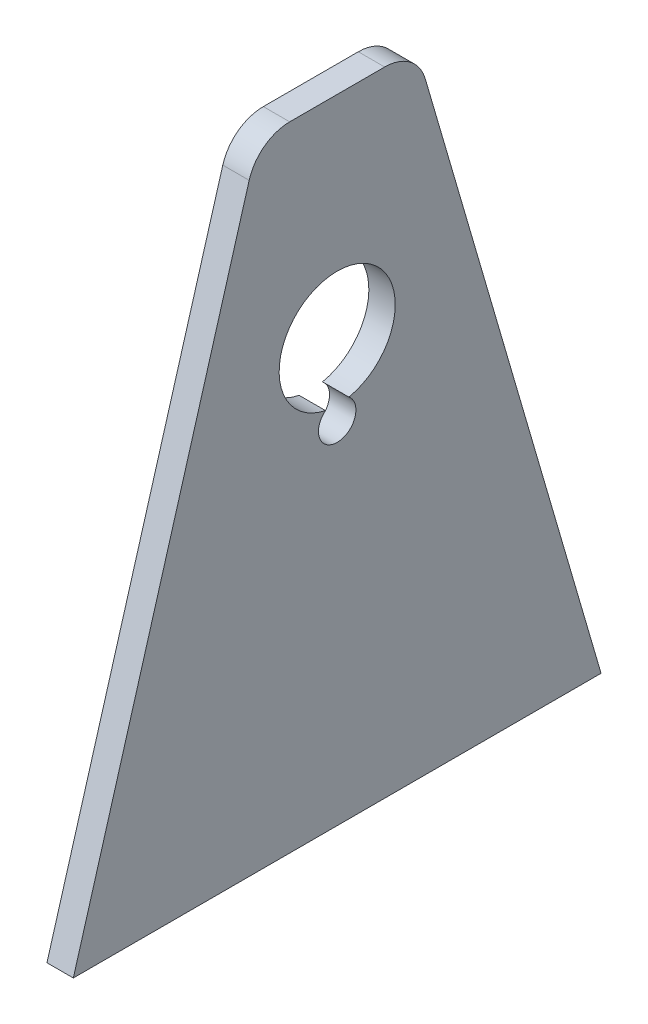
ISO-10303-21;
HEADER;
FILE_DESCRIPTION(('STEP AP214'),'2;1');
FILE_NAME('part.step','',(''),(''),'','','');
FILE_SCHEMA(('AUTOMOTIVE_DESIGN { 1 0 10303 214 1 1 1 1 }'));
ENDSEC;
DATA;
#1=APPLICATION_CONTEXT('core data for automotive mechanical design processes');
#2=APPLICATION_PROTOCOL_DEFINITION('international standard','automotive_design',2000,#1);
#3=PRODUCT_CONTEXT('',#1,'mechanical');
#4=PRODUCT('Part','Part','',(#3));
#5=PRODUCT_RELATED_PRODUCT_CATEGORY('part','',(#4));
#6=PRODUCT_DEFINITION_FORMATION('','',#4);
#7=PRODUCT_DEFINITION_CONTEXT('part definition',#1,'design');
#8=PRODUCT_DEFINITION('design','',#6,#7);
#9=PRODUCT_DEFINITION_SHAPE('','',#8);
#10=(LENGTH_UNIT() NAMED_UNIT(*) SI_UNIT(.MILLI.,.METRE.));
#11=(NAMED_UNIT(*) PLANE_ANGLE_UNIT() SI_UNIT($,.RADIAN.));
#12=(NAMED_UNIT(*) SI_UNIT($,.STERADIAN.) SOLID_ANGLE_UNIT());
#13=UNCERTAINTY_MEASURE_WITH_UNIT(LENGTH_MEASURE(1.E-05),#10,'distance_accuracy_value','');
#14=(GEOMETRIC_REPRESENTATION_CONTEXT(3) GLOBAL_UNCERTAINTY_ASSIGNED_CONTEXT((#13)) GLOBAL_UNIT_ASSIGNED_CONTEXT((#10,
#11,#12)) REPRESENTATION_CONTEXT('',''));
#15=CARTESIAN_POINT('',(0.,0.,0.));
#16=DIRECTION('',(0.,0.,1.));
#17=DIRECTION('',(1.,0.,0.));
#18=AXIS2_PLACEMENT_3D('',#15,#16,#17);
#19=CARTESIAN_POINT('',(6.35,0.,0.));
#20=DIRECTION('',(-1.,0.,0.));
#21=DIRECTION('',(0.,0.,1.));
#22=AXIS2_PLACEMENT_3D('',#19,#20,#21);
#23=PLANE('',#22);
#24=DIRECTION('',(0.,0.96,0.28));
#25=VECTOR('',#24,1.);
#26=CARTESIAN_POINT('',(6.35,50.8,-19.05));
#27=LINE('',#26,#25);
#28=CARTESIAN_POINT('',(6.35,-101.6,-63.5));
#29=VERTEX_POINT('',#28);
#30=CARTESIAN_POINT('',(6.35,43.4848,-21.1836));
#31=VERTEX_POINT('',#30);
#32=EDGE_CURVE('E127',#29,#31,#27,.T.);
#33=ORIENTED_EDGE('',*,*,#32,.T.);
#34=CARTESIAN_POINT('',(6.35,40.64,-11.43));
#35=DIRECTION('',(-1.,0.,0.));
#36=DIRECTION('',(0.,0.,1.));
#37=AXIS2_PLACEMENT_3D('',#34,#35,#36);
#38=CIRCLE('',#37,10.16);
#39=CARTESIAN_POINT('',(6.35,50.8,-11.43));
#40=VERTEX_POINT('',#39);
#41=EDGE_CURVE('E41',#31,#40,#38,.F.);
#42=ORIENTED_EDGE('',*,*,#41,.T.);
#43=DIRECTION('',(0.,0.,1.));
#44=VECTOR('',#43,1.);
#45=CARTESIAN_POINT('',(6.35,50.8,19.05));
#46=LINE('',#45,#44);
#47=CARTESIAN_POINT('',(6.35,50.8,11.43));
#48=VERTEX_POINT('',#47);
#49=EDGE_CURVE('E130',#40,#48,#46,.T.);
#50=ORIENTED_EDGE('',*,*,#49,.T.);
#51=CARTESIAN_POINT('',(6.35,40.64,11.43));
#52=DIRECTION('',(-1.,0.,0.));
#53=DIRECTION('',(0.,0.,1.));
#54=AXIS2_PLACEMENT_3D('',#51,#52,#53);
#55=CIRCLE('',#54,10.16);
#56=CARTESIAN_POINT('',(6.35,43.4848,21.1836));
#57=VERTEX_POINT('',#56);
#58=EDGE_CURVE('E48',#48,#57,#55,.F.);
#59=ORIENTED_EDGE('',*,*,#58,.T.);
#60=DIRECTION('',(0.,-0.96,0.28));
#61=VECTOR('',#60,1.);
#62=CARTESIAN_POINT('',(6.35,-101.6,63.5));
#63=LINE('',#62,#61);
#64=CARTESIAN_POINT('',(6.35,-101.6,63.5));
#65=VERTEX_POINT('',#64);
#66=EDGE_CURVE('E132',#57,#65,#63,.T.);
#67=ORIENTED_EDGE('',*,*,#66,.T.);
#68=DIRECTION('',(0.,0.,-1.));
#69=VECTOR('',#68,1.);
#70=CARTESIAN_POINT('',(6.35,-101.6,-63.5));
#71=LINE('',#70,#69);
#72=EDGE_CURVE('E124',#65,#29,#71,.T.);
#73=ORIENTED_EDGE('',*,*,#72,.T.);
#74=EDGE_LOOP('',(#33,#42,#50,#59,#67,#73));
#75=FACE_BOUND('',#74,.T.);
#76=CARTESIAN_POINT('',(6.35,-17.2085,0.));
#77=DIRECTION('',(1.,0.,0.));
#78=DIRECTION('',(0.,0.,1.));
#79=AXIS2_PLACEMENT_3D('',#76,#77,#78);
#80=CIRCLE('',#79,4.5085);
#81=CARTESIAN_POINT('',(6.35,-13.6841328413284,2.81165580768292));
#82=VERTEX_POINT('',#81);
#83=CARTESIAN_POINT('',(6.35,-13.6841328413284,-2.81165580768295));
#84=VERTEX_POINT('',#83);
#85=EDGE_CURVE('E110',#82,#84,#80,.T.);
#86=ORIENTED_EDGE('',*,*,#85,.F.);
#87=CARTESIAN_POINT('',(6.35,0.,0.));
#88=DIRECTION('',(1.,0.,0.));
#89=DIRECTION('',(0.,0.,-1.));
#90=AXIS2_PLACEMENT_3D('',#87,#88,#89);
#91=CIRCLE('',#90,13.97);
#92=EDGE_CURVE('E100',#84,#82,#91,.T.);
#93=ORIENTED_EDGE('',*,*,#92,.F.);
#94=EDGE_LOOP('',(#86,#93));
#95=FACE_BOUND('',#94,.T.);
#96=ADVANCED_FACE('F33',(#75,#95),#23,.F.);
#97=CARTESIAN_POINT('',(0.,0.,0.));
#98=DIRECTION('',(-1.,0.,0.));
#99=DIRECTION('',(0.,0.,1.));
#100=AXIS2_PLACEMENT_3D('',#97,#98,#99);
#101=PLANE('',#100);
#102=DIRECTION('',(0.,0.,1.));
#103=VECTOR('',#102,1.);
#104=CARTESIAN_POINT('',(0.,50.8,19.05));
#105=LINE('',#104,#103);
#106=CARTESIAN_POINT('',(0.,50.8,-11.43));
#107=VERTEX_POINT('',#106);
#108=CARTESIAN_POINT('',(0.,50.8,11.43));
#109=VERTEX_POINT('',#108);
#110=EDGE_CURVE('E139',#107,#109,#105,.T.);
#111=ORIENTED_EDGE('',*,*,#110,.F.);
#112=CARTESIAN_POINT('',(0.,40.64,-11.43));
#113=DIRECTION('',(-1.,0.,0.));
#114=DIRECTION('',(0.,0.,1.));
#115=AXIS2_PLACEMENT_3D('',#112,#113,#114);
#116=CIRCLE('',#115,10.16);
#117=CARTESIAN_POINT('',(0.,43.4848,-21.1836));
#118=VERTEX_POINT('',#117);
#119=EDGE_CURVE('E155',#107,#118,#116,.T.);
#120=ORIENTED_EDGE('',*,*,#119,.T.);
#121=DIRECTION('',(0.,0.96,0.28));
#122=VECTOR('',#121,1.);
#123=CARTESIAN_POINT('',(0.,50.8,-19.05));
#124=LINE('',#123,#122);
#125=CARTESIAN_POINT('',(0.,-101.6,-63.5));
#126=VERTEX_POINT('',#125);
#127=EDGE_CURVE('E137',#126,#118,#124,.T.);
#128=ORIENTED_EDGE('',*,*,#127,.F.);
#129=DIRECTION('',(0.,0.,-1.));
#130=VECTOR('',#129,1.);
#131=CARTESIAN_POINT('',(0.,-101.6,-63.5));
#132=LINE('',#131,#130);
#133=CARTESIAN_POINT('',(0.,-101.6,63.5));
#134=VERTEX_POINT('',#133);
#135=EDGE_CURVE('E123',#134,#126,#132,.T.);
#136=ORIENTED_EDGE('',*,*,#135,.F.);
#137=DIRECTION('',(0.,-0.96,0.28));
#138=VECTOR('',#137,1.);
#139=CARTESIAN_POINT('',(0.,-101.6,63.5));
#140=LINE('',#139,#138);
#141=CARTESIAN_POINT('',(0.,43.4848,21.1836));
#142=VERTEX_POINT('',#141);
#143=EDGE_CURVE('E128',#142,#134,#140,.T.);
#144=ORIENTED_EDGE('',*,*,#143,.F.);
#145=CARTESIAN_POINT('',(0.,40.64,11.43));
#146=DIRECTION('',(-1.,0.,0.));
#147=DIRECTION('',(0.,0.,1.));
#148=AXIS2_PLACEMENT_3D('',#145,#146,#147);
#149=CIRCLE('',#148,10.16);
#150=EDGE_CURVE('E153',#142,#109,#149,.T.);
#151=ORIENTED_EDGE('',*,*,#150,.T.);
#152=EDGE_LOOP('',(#111,#120,#128,#136,#144,#151));
#153=FACE_BOUND('',#152,.T.);
#154=CARTESIAN_POINT('',(0.,0.,0.));
#155=DIRECTION('',(1.,0.,0.));
#156=DIRECTION('',(0.,0.,-1.));
#157=AXIS2_PLACEMENT_3D('',#154,#155,#156);
#158=CIRCLE('',#157,13.97);
#159=CARTESIAN_POINT('',(0.,-13.6841328413284,-2.81165580768295));
#160=VERTEX_POINT('',#159);
#161=CARTESIAN_POINT('',(0.,-13.6841328413284,2.81165580768292));
#162=VERTEX_POINT('',#161);
#163=EDGE_CURVE('E117',#160,#162,#158,.T.);
#164=ORIENTED_EDGE('',*,*,#163,.T.);
#165=CARTESIAN_POINT('',(0.,-17.2085,0.));
#166=DIRECTION('',(1.,0.,0.));
#167=DIRECTION('',(0.,0.,1.));
#168=AXIS2_PLACEMENT_3D('',#165,#166,#167);
#169=CIRCLE('',#168,4.5085);
#170=EDGE_CURVE('E115',#162,#160,#169,.T.);
#171=ORIENTED_EDGE('',*,*,#170,.T.);
#172=EDGE_LOOP('',(#164,#171));
#173=FACE_BOUND('',#172,.T.);
#174=ADVANCED_FACE('F168',(#153,#173),#101,.T.);
#175=CARTESIAN_POINT('',(6.35,-101.6,-63.5));
#176=DIRECTION('',(0.,1.,0.));
#177=DIRECTION('',(0.,0.,1.));
#178=AXIS2_PLACEMENT_3D('',#175,#176,#177);
#179=PLANE('',#178);
#180=ORIENTED_EDGE('',*,*,#135,.T.);
#181=DIRECTION('',(-1.,0.,0.));
#182=VECTOR('',#181,1.);
#183=CARTESIAN_POINT('',(6.35,-101.6,-63.5));
#184=LINE('',#183,#182);
#185=EDGE_CURVE('E145',#29,#126,#184,.T.);
#186=ORIENTED_EDGE('',*,*,#185,.F.);
#187=ORIENTED_EDGE('',*,*,#72,.F.);
#188=DIRECTION('',(-1.,0.,0.));
#189=VECTOR('',#188,1.);
#190=CARTESIAN_POINT('',(6.35,-101.6,63.5));
#191=LINE('',#190,#189);
#192=EDGE_CURVE('E134',#65,#134,#191,.T.);
#193=ORIENTED_EDGE('',*,*,#192,.T.);
#194=EDGE_LOOP('',(#180,#186,#187,#193));
#195=FACE_BOUND('',#194,.T.);
#196=ADVANCED_FACE('F175',(#195),#179,.F.);
#197=CARTESIAN_POINT('',(6.35,50.8,-19.05));
#198=DIRECTION('',(0.,-0.28,0.96));
#199=DIRECTION('',(0.,-0.96,-0.28));
#200=AXIS2_PLACEMENT_3D('',#197,#198,#199);
#201=PLANE('',#200);
#202=ORIENTED_EDGE('',*,*,#127,.T.);
#203=DIRECTION('',(-1.,0.,0.));
#204=VECTOR('',#203,1.);
#205=CARTESIAN_POINT('',(6.35,43.4848,-21.1836));
#206=LINE('',#205,#204);
#207=EDGE_CURVE('E56',#118,#31,#206,.F.);
#208=ORIENTED_EDGE('',*,*,#207,.T.);
#209=ORIENTED_EDGE('',*,*,#32,.F.);
#210=ORIENTED_EDGE('',*,*,#185,.T.);
#211=EDGE_LOOP('',(#202,#208,#209,#210));
#212=FACE_BOUND('',#211,.T.);
#213=ADVANCED_FACE('F171',(#212),#201,.F.);
#214=CARTESIAN_POINT('',(6.35,50.8,19.05));
#215=DIRECTION('',(0.,-1.,0.));
#216=DIRECTION('',(0.,0.,-1.));
#217=AXIS2_PLACEMENT_3D('',#214,#215,#216);
#218=PLANE('',#217);
#219=ORIENTED_EDGE('',*,*,#49,.F.);
#220=DIRECTION('',(-1.,0.,0.));
#221=VECTOR('',#220,1.);
#222=CARTESIAN_POINT('',(6.35,50.8,-11.43));
#223=LINE('',#222,#221);
#224=EDGE_CURVE('E150',#40,#107,#223,.T.);
#225=ORIENTED_EDGE('',*,*,#224,.T.);
#226=ORIENTED_EDGE('',*,*,#110,.T.);
#227=DIRECTION('',(-1.,0.,0.));
#228=VECTOR('',#227,1.);
#229=CARTESIAN_POINT('',(6.35,50.8,11.43));
#230=LINE('',#229,#228);
#231=EDGE_CURVE('E148',#109,#48,#230,.F.);
#232=ORIENTED_EDGE('',*,*,#231,.T.);
#233=EDGE_LOOP('',(#219,#225,#226,#232));
#234=FACE_BOUND('',#233,.T.);
#235=ADVANCED_FACE('F163',(#234),#218,.F.);
#236=CARTESIAN_POINT('',(6.35,-101.6,63.5));
#237=DIRECTION('',(0.,-0.28,-0.96));
#238=DIRECTION('',(0.,0.96,-0.28));
#239=AXIS2_PLACEMENT_3D('',#236,#237,#238);
#240=PLANE('',#239);
#241=ORIENTED_EDGE('',*,*,#66,.F.);
#242=DIRECTION('',(-1.,0.,0.));
#243=VECTOR('',#242,1.);
#244=CARTESIAN_POINT('',(6.35,43.4848,21.1836));
#245=LINE('',#244,#243);
#246=EDGE_CURVE('E11',#57,#142,#245,.T.);
#247=ORIENTED_EDGE('',*,*,#246,.T.);
#248=ORIENTED_EDGE('',*,*,#143,.T.);
#249=ORIENTED_EDGE('',*,*,#192,.F.);
#250=EDGE_LOOP('',(#241,#247,#248,#249));
#251=FACE_BOUND('',#250,.T.);
#252=ADVANCED_FACE('F179',(#251),#240,.F.);
#253=CARTESIAN_POINT('',(6.35,-17.2085,0.));
#254=DIRECTION('',(-1.,0.,0.));
#255=DIRECTION('',(0.,0.,1.));
#256=AXIS2_PLACEMENT_3D('',#253,#254,#255);
#257=CYLINDRICAL_SURFACE('',#256,4.5085);
#258=ORIENTED_EDGE('',*,*,#170,.F.);
#259=DIRECTION('',(-1.,0.,0.));
#260=VECTOR('',#259,1.);
#261=CARTESIAN_POINT('',(6.35,-13.6841328413284,2.81165580768292));
#262=LINE('',#261,#260);
#263=EDGE_CURVE('E103',#82,#162,#262,.T.);
#264=ORIENTED_EDGE('',*,*,#263,.F.);
#265=ORIENTED_EDGE('',*,*,#85,.T.);
#266=DIRECTION('',(-1.,0.,0.));
#267=VECTOR('',#266,1.);
#268=CARTESIAN_POINT('',(6.35,-13.6841328413284,-2.81165580768295));
#269=LINE('',#268,#267);
#270=EDGE_CURVE('E106',#84,#160,#269,.T.);
#271=ORIENTED_EDGE('',*,*,#270,.T.);
#272=EDGE_LOOP('',(#258,#264,#265,#271));
#273=FACE_BOUND('',#272,.T.);
#274=ADVANCED_FACE('F113',(#273),#257,.F.);
#275=CARTESIAN_POINT('',(6.35,0.,0.));
#276=DIRECTION('',(-1.,0.,0.));
#277=DIRECTION('',(0.,0.,1.));
#278=AXIS2_PLACEMENT_3D('',#275,#276,#277);
#279=CYLINDRICAL_SURFACE('',#278,13.97);
#280=ORIENTED_EDGE('',*,*,#163,.F.);
#281=ORIENTED_EDGE('',*,*,#270,.F.);
#282=ORIENTED_EDGE('',*,*,#92,.T.);
#283=ORIENTED_EDGE('',*,*,#263,.T.);
#284=EDGE_LOOP('',(#280,#281,#282,#283));
#285=FACE_BOUND('',#284,.T.);
#286=ADVANCED_FACE('F102',(#285),#279,.F.);
#287=CARTESIAN_POINT('',(6.35,40.64,-11.43));
#288=DIRECTION('',(-1.,0.,0.));
#289=DIRECTION('',(0.,0.,1.));
#290=AXIS2_PLACEMENT_3D('',#287,#288,#289);
#291=CYLINDRICAL_SURFACE('',#290,10.16);
#292=ORIENTED_EDGE('',*,*,#41,.F.);
#293=ORIENTED_EDGE('',*,*,#207,.F.);
#294=ORIENTED_EDGE('',*,*,#119,.F.);
#295=ORIENTED_EDGE('',*,*,#224,.F.);
#296=EDGE_LOOP('',(#292,#293,#294,#295));
#297=FACE_BOUND('',#296,.T.);
#298=ADVANCED_FACE('F166',(#297),#291,.T.);
#299=CARTESIAN_POINT('',(6.35,40.64,11.43));
#300=DIRECTION('',(-1.,0.,0.));
#301=DIRECTION('',(0.,0.,1.));
#302=AXIS2_PLACEMENT_3D('',#299,#300,#301);
#303=CYLINDRICAL_SURFACE('',#302,10.16);
#304=ORIENTED_EDGE('',*,*,#58,.F.);
#305=ORIENTED_EDGE('',*,*,#231,.F.);
#306=ORIENTED_EDGE('',*,*,#150,.F.);
#307=ORIENTED_EDGE('',*,*,#246,.F.);
#308=EDGE_LOOP('',(#304,#305,#306,#307));
#309=FACE_BOUND('',#308,.T.);
#310=ADVANCED_FACE('F35',(#309),#303,.T.);
#311=CLOSED_SHELL('',(#96,#174,#196,#213,#235,#252,#274,#286,#298,#310));
#312=MANIFOLD_SOLID_BREP('B2',#311);
#313=ADVANCED_BREP_SHAPE_REPRESENTATION('',(#18,#312),#14);
#314=SHAPE_DEFINITION_REPRESENTATION(#9,#313);
ENDSEC;
END-ISO-10303-21;
